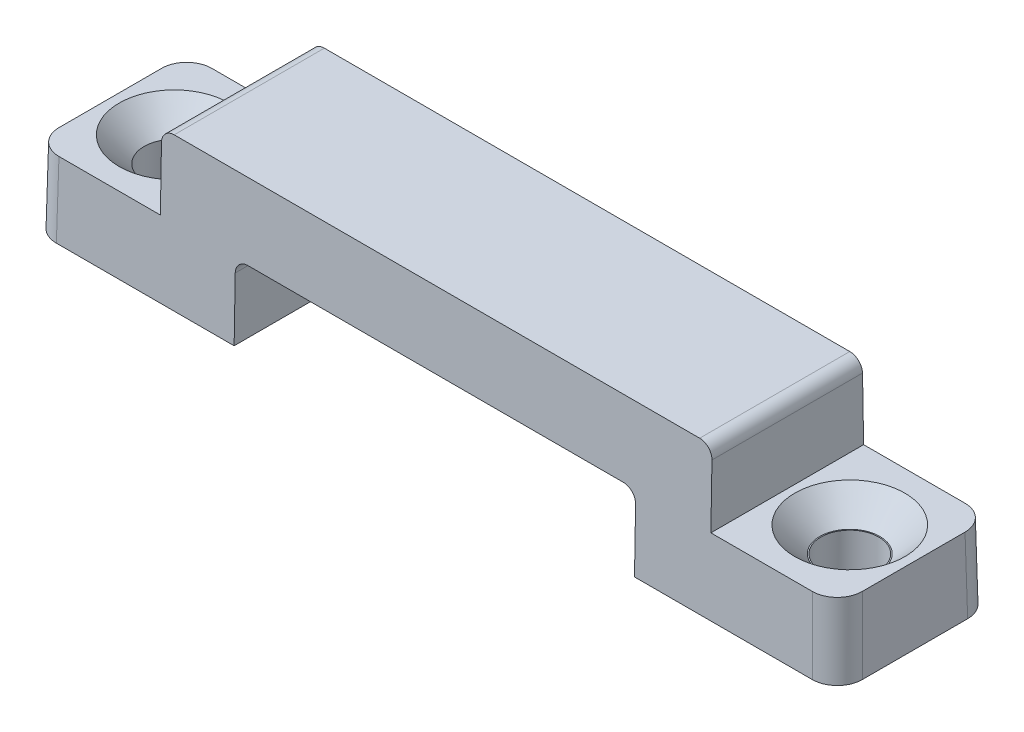
ISO-10303-21;
HEADER;
FILE_DESCRIPTION(('STEP AP214'),'2;1');
FILE_NAME('part.step','',(''),(''),'','','');
FILE_SCHEMA(('AUTOMOTIVE_DESIGN { 1 0 10303 214 1 1 1 1 }'));
ENDSEC;
DATA;
#1=APPLICATION_CONTEXT('core data for automotive mechanical design processes');
#2=APPLICATION_PROTOCOL_DEFINITION('international standard','automotive_design',2000,#1);
#3=PRODUCT_CONTEXT('',#1,'mechanical');
#4=PRODUCT('Part','Part','',(#3));
#5=PRODUCT_RELATED_PRODUCT_CATEGORY('part','',(#4));
#6=PRODUCT_DEFINITION_FORMATION('','',#4);
#7=PRODUCT_DEFINITION_CONTEXT('part definition',#1,'design');
#8=PRODUCT_DEFINITION('design','',#6,#7);
#9=PRODUCT_DEFINITION_SHAPE('','',#8);
#10=(LENGTH_UNIT() NAMED_UNIT(*) SI_UNIT(.MILLI.,.METRE.));
#11=(NAMED_UNIT(*) PLANE_ANGLE_UNIT() SI_UNIT($,.RADIAN.));
#12=(NAMED_UNIT(*) SI_UNIT($,.STERADIAN.) SOLID_ANGLE_UNIT());
#13=UNCERTAINTY_MEASURE_WITH_UNIT(LENGTH_MEASURE(1.E-05),#10,'distance_accuracy_value','');
#14=(GEOMETRIC_REPRESENTATION_CONTEXT(3) GLOBAL_UNCERTAINTY_ASSIGNED_CONTEXT((#13)) GLOBAL_UNIT_ASSIGNED_CONTEXT((#10,
#11,#12)) REPRESENTATION_CONTEXT('',''));
#15=CARTESIAN_POINT('',(0.,0.,0.));
#16=DIRECTION('',(0.,0.,1.));
#17=DIRECTION('',(1.,0.,0.));
#18=AXIS2_PLACEMENT_3D('',#15,#16,#17);
#19=CARTESIAN_POINT('',(-11.,0.,3.));
#20=DIRECTION('',(0.,1.,0.));
#21=DIRECTION('',(-1.,0.,0.));
#22=AXIS2_PLACEMENT_3D('',#19,#20,#21);
#23=PLANE('',#22);
#24=CARTESIAN_POINT('',(-13.5,0.,0.));
#25=DIRECTION('',(0.,1.,0.));
#26=DIRECTION('',(-1.,0.,0.));
#27=AXIS2_PLACEMENT_3D('',#24,#25,#26);
#28=CIRCLE('',#27,1.24339997436883);
#29=CARTESIAN_POINT('',(-14.7433999743688,0.,0.));
#30=VERTEX_POINT('',#29);
#31=EDGE_CURVE('E730',#30,#30,#28,.F.);
#32=ORIENTED_EDGE('',*,*,#31,.F.);
#33=EDGE_LOOP('',(#32));
#34=FACE_BOUND('',#33,.T.);
#35=DIRECTION('',(0.,0.,1.));
#36=VECTOR('',#35,1.);
#37=CARTESIAN_POINT('',(-16.1047303895693,0.,3.));
#38=LINE('',#37,#36);
#39=CARTESIAN_POINT('',(-16.1047303895693,0.,2.10488269441291));
#40=VERTEX_POINT('',#39);
#41=CARTESIAN_POINT('',(-16.1047303895693,0.,-2.10488269441291));
#42=VERTEX_POINT('',#41);
#43=EDGE_CURVE('E254',#40,#42,#38,.F.);
#44=ORIENTED_EDGE('',*,*,#43,.T.);
#45=CARTESIAN_POINT('',(-15.1045780615254,0.,-2.1045780615254));
#46=DIRECTION('',(0.,1.,0.));
#47=DIRECTION('',(-0.707106781186544,0.,-0.707106781186551));
#48=AXIS2_PLACEMENT_3D('',#45,#46,#47);
#49=ELLIPSE('',#48,1.00030463289105,1.);
#50=CARTESIAN_POINT('',(-15.1048826944129,0.,-3.10473038956931));
#51=VERTEX_POINT('',#50);
#52=EDGE_CURVE('E359',#42,#51,#49,.F.);
#53=ORIENTED_EDGE('',*,*,#52,.T.);
#54=DIRECTION('',(-1.,0.,0.));
#55=VECTOR('',#54,1.);
#56=CARTESIAN_POINT('',(-11.,0.,-3.10473038956931));
#57=LINE('',#56,#55);
#58=CARTESIAN_POINT('',(-8.,0.,-3.10473038956931));
#59=VERTEX_POINT('',#58);
#60=EDGE_CURVE('E275',#51,#59,#57,.F.);
#61=ORIENTED_EDGE('',*,*,#60,.T.);
#62=DIRECTION('',(0.,0.,-1.));
#63=VECTOR('',#62,1.);
#64=CARTESIAN_POINT('',(-8.,0.,3.));
#65=LINE('',#64,#63);
#66=CARTESIAN_POINT('',(-8.,0.,3.10473038956931));
#67=VERTEX_POINT('',#66);
#68=EDGE_CURVE('E391',#67,#59,#65,.T.);
#69=ORIENTED_EDGE('',*,*,#68,.F.);
#70=DIRECTION('',(1.,0.,0.));
#71=VECTOR('',#70,1.);
#72=CARTESIAN_POINT('',(-11.,0.,3.10473038956931));
#73=LINE('',#72,#71);
#74=CARTESIAN_POINT('',(-15.1048826944129,0.,3.10473038956931));
#75=VERTEX_POINT('',#74);
#76=EDGE_CURVE('E248',#75,#67,#73,.T.);
#77=ORIENTED_EDGE('',*,*,#76,.F.);
#78=CARTESIAN_POINT('',(-15.1045780615254,0.,2.1045780615254));
#79=DIRECTION('',(0.,1.,0.));
#80=DIRECTION('',(-0.707106781186544,0.,0.707106781186551));
#81=AXIS2_PLACEMENT_3D('',#78,#79,#80);
#82=ELLIPSE('',#81,1.00030463289105,1.);
#83=EDGE_CURVE('E357',#75,#40,#82,.F.);
#84=ORIENTED_EDGE('',*,*,#83,.T.);
#85=EDGE_LOOP('',(#44,#53,#61,#69,#77,#84));
#86=FACE_BOUND('',#85,.T.);
#87=ADVANCED_FACE('F42',(#34,#86),#23,.F.);
#88=CARTESIAN_POINT('',(-8.,0.,3.));
#89=DIRECTION('',(-1.,0.,0.));
#90=DIRECTION('',(0.,0.,1.));
#91=AXIS2_PLACEMENT_3D('',#88,#89,#90);
#92=PLANE('',#91);
#93=DIRECTION('',(0.,-0.999847695156391,-0.0174524064372835));
#94=VECTOR('',#93,1.);
#95=CARTESIAN_POINT('',(-8.,0.106526009050215,-3.10287097116479));
#96=LINE('',#95,#94);
#97=CARTESIAN_POINT('',(-8.,2.5,-3.06109272724876));
#98=VERTEX_POINT('',#97);
#99=EDGE_CURVE('E273',#59,#98,#96,.F.);
#100=ORIENTED_EDGE('',*,*,#99,.T.);
#101=DIRECTION('',(0.,0.,-1.));
#102=VECTOR('',#101,1.);
#103=CARTESIAN_POINT('',(-8.,2.5,3.));
#104=LINE('',#103,#102);
#105=CARTESIAN_POINT('',(-8.,2.5,3.06109272724876));
#106=VERTEX_POINT('',#105);
#107=EDGE_CURVE('E388',#98,#106,#104,.F.);
#108=ORIENTED_EDGE('',*,*,#107,.T.);
#109=DIRECTION('',(0.,0.999847695156391,-0.0174524064372835));
#110=VECTOR('',#109,1.);
#111=CARTESIAN_POINT('',(-8.,0.00182751894271233,3.1046984901075));
#112=LINE('',#111,#110);
#113=EDGE_CURVE('E270',#67,#106,#112,.T.);
#114=ORIENTED_EDGE('',*,*,#113,.F.);
#115=ORIENTED_EDGE('',*,*,#68,.T.);
#116=EDGE_LOOP('',(#100,#108,#114,#115));
#117=FACE_BOUND('',#116,.T.);
#118=ADVANCED_FACE('F389',(#117),#92,.F.);
#119=CARTESIAN_POINT('',(-8.,3.,3.));
#120=DIRECTION('',(0.,1.,0.));
#121=DIRECTION('',(-1.,0.,0.));
#122=AXIS2_PLACEMENT_3D('',#119,#120,#121);
#123=PLANE('',#122);
#124=DIRECTION('',(1.,0.,0.));
#125=VECTOR('',#124,1.);
#126=CARTESIAN_POINT('',(-8.,3.,3.05236519478465));
#127=LINE('',#126,#125);
#128=CARTESIAN_POINT('',(-7.5,3.,3.05236519478465));
#129=VERTEX_POINT('',#128);
#130=CARTESIAN_POINT('',(7.5,3.,3.05236519478465));
#131=VERTEX_POINT('',#130);
#132=EDGE_CURVE('E308',#129,#131,#127,.T.);
#133=ORIENTED_EDGE('',*,*,#132,.F.);
#134=DIRECTION('',(0.,0.,-1.));
#135=VECTOR('',#134,1.);
#136=CARTESIAN_POINT('',(-7.5,3.,-3.));
#137=LINE('',#136,#135);
#138=CARTESIAN_POINT('',(-7.5,3.,-3.05236519478465));
#139=VERTEX_POINT('',#138);
#140=EDGE_CURVE('E400',#129,#139,#137,.T.);
#141=ORIENTED_EDGE('',*,*,#140,.T.);
#142=DIRECTION('',(-1.,0.,0.));
#143=VECTOR('',#142,1.);
#144=CARTESIAN_POINT('',(-8.,3.,-3.05236519478465));
#145=LINE('',#144,#143);
#146=CARTESIAN_POINT('',(7.5,3.,-3.05236519478465));
#147=VERTEX_POINT('',#146);
#148=EDGE_CURVE('E278',#139,#147,#145,.F.);
#149=ORIENTED_EDGE('',*,*,#148,.T.);
#150=DIRECTION('',(0.,0.,-1.));
#151=VECTOR('',#150,1.);
#152=CARTESIAN_POINT('',(7.5,3.,3.));
#153=LINE('',#152,#151);
#154=EDGE_CURVE('E404',#147,#131,#153,.F.);
#155=ORIENTED_EDGE('',*,*,#154,.T.);
#156=EDGE_LOOP('',(#133,#141,#149,#155));
#157=FACE_BOUND('',#156,.T.);
#158=ADVANCED_FACE('F434',(#157),#123,.F.);
#159=CARTESIAN_POINT('',(8.,3.,3.));
#160=DIRECTION('',(1.,0.,0.));
#161=DIRECTION('',(0.,0.,-1.));
#162=AXIS2_PLACEMENT_3D('',#159,#160,#161);
#163=PLANE('',#162);
#164=DIRECTION('',(0.,-0.999847695156391,0.0174524064372835));
#165=VECTOR('',#164,1.);
#166=CARTESIAN_POINT('',(8.,3.00091375947136,3.05234924505375));
#167=LINE('',#166,#165);
#168=CARTESIAN_POINT('',(8.,2.5,3.06109272724876));
#169=VERTEX_POINT('',#168);
#170=CARTESIAN_POINT('',(8.,0.,3.10473038956931));
#171=VERTEX_POINT('',#170);
#172=EDGE_CURVE('E304',#169,#171,#167,.T.);
#173=ORIENTED_EDGE('',*,*,#172,.F.);
#174=DIRECTION('',(0.,0.,-1.));
#175=VECTOR('',#174,1.);
#176=CARTESIAN_POINT('',(8.,2.5,-3.));
#177=LINE('',#176,#175);
#178=CARTESIAN_POINT('',(8.,2.5,-3.06109272724876));
#179=VERTEX_POINT('',#178);
#180=EDGE_CURVE('E284',#169,#179,#177,.T.);
#181=ORIENTED_EDGE('',*,*,#180,.T.);
#182=DIRECTION('',(0.,0.999847695156391,0.0174524064372835));
#183=VECTOR('',#182,1.);
#184=CARTESIAN_POINT('',(8.,3.10561224957886,-3.05052172611104));
#185=LINE('',#184,#183);
#186=CARTESIAN_POINT('',(8.,0.,-3.10473038956931));
#187=VERTEX_POINT('',#186);
#188=EDGE_CURVE('E286',#179,#187,#185,.F.);
#189=ORIENTED_EDGE('',*,*,#188,.T.);
#190=DIRECTION('',(0.,0.,-1.));
#191=VECTOR('',#190,1.);
#192=CARTESIAN_POINT('',(8.,0.,3.));
#193=LINE('',#192,#191);
#194=EDGE_CURVE('E305',#171,#187,#193,.T.);
#195=ORIENTED_EDGE('',*,*,#194,.F.);
#196=EDGE_LOOP('',(#173,#181,#189,#195));
#197=FACE_BOUND('',#196,.T.);
#198=ADVANCED_FACE('F442',(#197),#163,.F.);
#199=CARTESIAN_POINT('',(16.,0.,3.));
#200=DIRECTION('',(0.,1.,0.));
#201=DIRECTION('',(-1.,0.,0.));
#202=AXIS2_PLACEMENT_3D('',#199,#200,#201);
#203=PLANE('',#202);
#204=CARTESIAN_POINT('',(13.5,0.,0.));
#205=DIRECTION('',(0.,1.,0.));
#206=DIRECTION('',(-1.,0.,0.));
#207=AXIS2_PLACEMENT_3D('',#204,#205,#206);
#208=CIRCLE('',#207,1.15667148221935);
#209=CARTESIAN_POINT('',(12.3433285177807,0.,0.));
#210=VERTEX_POINT('',#209);
#211=EDGE_CURVE('E720',#210,#210,#208,.F.);
#212=ORIENTED_EDGE('',*,*,#211,.F.);
#213=EDGE_LOOP('',(#212));
#214=FACE_BOUND('',#213,.T.);
#215=DIRECTION('',(-1.,0.,0.));
#216=VECTOR('',#215,1.);
#217=CARTESIAN_POINT('',(16.,0.,-3.10473038956931));
#218=LINE('',#217,#216);
#219=CARTESIAN_POINT('',(15.1048826944129,0.,-3.10473038956931));
#220=VERTEX_POINT('',#219);
#221=EDGE_CURVE('E230',#187,#220,#218,.F.);
#222=ORIENTED_EDGE('',*,*,#221,.T.);
#223=CARTESIAN_POINT('',(15.1045780615254,0.,-2.1045780615254));
#224=DIRECTION('',(0.,1.,0.));
#225=DIRECTION('',(-0.707106781186545,0.,0.70710678118655));
#226=AXIS2_PLACEMENT_3D('',#223,#224,#225);
#227=ELLIPSE('',#226,1.00030463289105,1.);
#228=CARTESIAN_POINT('',(16.1047303895693,0.,-2.10488269441291));
#229=VERTEX_POINT('',#228);
#230=EDGE_CURVE('E345',#220,#229,#227,.F.);
#231=ORIENTED_EDGE('',*,*,#230,.T.);
#232=DIRECTION('',(0.,0.,1.));
#233=VECTOR('',#232,1.);
#234=CARTESIAN_POINT('',(16.1047303895693,0.,3.));
#235=LINE('',#234,#233);
#236=CARTESIAN_POINT('',(16.1047303895693,0.,2.10488269441291));
#237=VERTEX_POINT('',#236);
#238=EDGE_CURVE('E223',#237,#229,#235,.F.);
#239=ORIENTED_EDGE('',*,*,#238,.F.);
#240=CARTESIAN_POINT('',(15.1045780615254,0.,2.1045780615254));
#241=DIRECTION('',(0.,1.,0.));
#242=DIRECTION('',(-0.707106781186545,0.,-0.70710678118655));
#243=AXIS2_PLACEMENT_3D('',#240,#241,#242);
#244=ELLIPSE('',#243,1.00030463289105,1.);
#245=CARTESIAN_POINT('',(15.1048826944129,0.,3.10473038956931));
#246=VERTEX_POINT('',#245);
#247=EDGE_CURVE('E339',#237,#246,#244,.F.);
#248=ORIENTED_EDGE('',*,*,#247,.T.);
#249=DIRECTION('',(1.,0.,0.));
#250=VECTOR('',#249,1.);
#251=CARTESIAN_POINT('',(16.,0.,3.10473038956931));
#252=LINE('',#251,#250);
#253=EDGE_CURVE('E191',#171,#246,#252,.T.);
#254=ORIENTED_EDGE('',*,*,#253,.F.);
#255=ORIENTED_EDGE('',*,*,#194,.T.);
#256=EDGE_LOOP('',(#222,#231,#239,#248,#254,#255));
#257=FACE_BOUND('',#256,.T.);
#258=ADVANCED_FACE('F448',(#214,#257),#203,.F.);
#259=CARTESIAN_POINT('',(16.,6.,3.));
#260=DIRECTION('',(0.999847695156391,0.0174524064372835,0.));
#261=DIRECTION('',(-0.0174524064372835,0.999847695156391,0.));
#262=AXIS2_PLACEMENT_3D('',#259,#260,#261);
#263=PLANE('',#262);
#264=ORIENTED_EDGE('',*,*,#238,.T.);
#265=DIRECTION('',(0.0174497491606827,-0.999695459881888,-0.0174497491606827));
#266=VECTOR('',#265,1.);
#267=CARTESIAN_POINT('',(15.9984774848953,6.08722483193201,-1.99862978973888));
#268=LINE('',#267,#266);
#269=CARTESIAN_POINT('',(16.0523651947847,3.,-2.05251749962826));
#270=VERTEX_POINT('',#269);
#271=EDGE_CURVE('E324',#229,#270,#268,.F.);
#272=ORIENTED_EDGE('',*,*,#271,.T.);
#273=DIRECTION('',(0.,0.,1.));
#274=VECTOR('',#273,1.);
#275=CARTESIAN_POINT('',(16.0523651947847,3.,3.));
#276=LINE('',#275,#274);
#277=CARTESIAN_POINT('',(16.0523651947847,3.,2.05251749962826));
#278=VERTEX_POINT('',#277);
#279=EDGE_CURVE('E207',#278,#270,#276,.F.);
#280=ORIENTED_EDGE('',*,*,#279,.F.);
#281=DIRECTION('',(-0.0174497491606827,0.999695459881888,-0.0174497491606827));
#282=VECTOR('',#281,1.);
#283=CARTESIAN_POINT('',(16.1050348369392,-0.0174417781400661,2.10518714178281));
#284=LINE('',#283,#282);
#285=EDGE_CURVE('E318',#278,#237,#284,.F.);
#286=ORIENTED_EDGE('',*,*,#285,.T.);
#287=EDGE_LOOP('',(#264,#272,#280,#286));
#288=FACE_BOUND('',#287,.T.);
#289=ADVANCED_FACE('F458',(#288),#263,.T.);
#290=CARTESIAN_POINT('',(11.,3.,3.));
#291=DIRECTION('',(0.,-1.,0.));
#292=DIRECTION('',(0.,0.,-1.));
#293=AXIS2_PLACEMENT_3D('',#290,#291,#292);
#294=PLANE('',#293);
#295=CARTESIAN_POINT('',(13.5,3.,0.));
#296=DIRECTION('',(0.,1.,0.));
#297=DIRECTION('',(0.,0.,1.));
#298=AXIS2_PLACEMENT_3D('',#295,#296,#297);
#299=CIRCLE('',#298,2.2);
#300=CARTESIAN_POINT('',(13.5,3.,2.2));
#301=VERTEX_POINT('',#300);
#302=EDGE_CURVE('E277',#301,#301,#299,.T.);
#303=ORIENTED_EDGE('',*,*,#302,.F.);
#304=EDGE_LOOP('',(#303));
#305=FACE_BOUND('',#304,.T.);
#306=ORIENTED_EDGE('',*,*,#279,.T.);
#307=CARTESIAN_POINT('',(15.0522128667407,3.,-2.05221286674075));
#308=DIRECTION('',(0.,-1.,0.));
#309=DIRECTION('',(-0.707106781186548,0.,0.707106781186548));
#310=AXIS2_PLACEMENT_3D('',#307,#308,#309);
#311=ELLIPSE('',#310,1.00030463289105,1.);
#312=CARTESIAN_POINT('',(15.0525174996283,3.,-3.05236519478465));
#313=VERTEX_POINT('',#312);
#314=EDGE_CURVE('E329',#270,#313,#311,.F.);
#315=ORIENTED_EDGE('',*,*,#314,.T.);
#316=DIRECTION('',(1.,0.,0.));
#317=VECTOR('',#316,1.);
#318=CARTESIAN_POINT('',(11.,3.,-3.05236519478465));
#319=LINE('',#318,#317);
#320=CARTESIAN_POINT('',(11.,3.,-3.05236519478465));
#321=VERTEX_POINT('',#320);
#322=EDGE_CURVE('E202',#313,#321,#319,.F.);
#323=ORIENTED_EDGE('',*,*,#322,.T.);
#324=DIRECTION('',(0.,0.,-1.));
#325=VECTOR('',#324,1.);
#326=CARTESIAN_POINT('',(11.,3.,3.));
#327=LINE('',#326,#325);
#328=CARTESIAN_POINT('',(11.,3.,3.05236519478465));
#329=VERTEX_POINT('',#328);
#330=EDGE_CURVE('E200',#329,#321,#327,.T.);
#331=ORIENTED_EDGE('',*,*,#330,.F.);
#332=DIRECTION('',(-1.,0.,0.));
#333=VECTOR('',#332,1.);
#334=CARTESIAN_POINT('',(11.,3.,3.05236519478465));
#335=LINE('',#334,#333);
#336=CARTESIAN_POINT('',(15.0525174996283,3.,3.05236519478465));
#337=VERTEX_POINT('',#336);
#338=EDGE_CURVE('E182',#337,#329,#335,.T.);
#339=ORIENTED_EDGE('',*,*,#338,.F.);
#340=CARTESIAN_POINT('',(15.0522128667407,3.,2.05221286674074));
#341=DIRECTION('',(0.,-1.,0.));
#342=DIRECTION('',(-0.707106781186548,0.,-0.707106781186548));
#343=AXIS2_PLACEMENT_3D('',#340,#341,#342);
#344=ELLIPSE('',#343,1.00030463289105,1.);
#345=EDGE_CURVE('E330',#337,#278,#344,.F.);
#346=ORIENTED_EDGE('',*,*,#345,.T.);
#347=EDGE_LOOP('',(#306,#315,#323,#331,#339,#346));
#348=FACE_BOUND('',#347,.T.);
#349=ADVANCED_FACE('F197',(#305,#348),#294,.F.);
#350=CARTESIAN_POINT('',(11.,3.,3.));
#351=DIRECTION('',(-1.,0.,0.));
#352=DIRECTION('',(0.,0.,1.));
#353=AXIS2_PLACEMENT_3D('',#350,#351,#352);
#354=PLANE('',#353);
#355=DIRECTION('',(0.,-0.999847695156391,-0.0174524064372835));
#356=VECTOR('',#355,1.);
#357=CARTESIAN_POINT('',(11.,3.10561224957886,-3.05052172611104));
#358=LINE('',#357,#356);
#359=CARTESIAN_POINT('',(11.,5.5,-3.00872753246411));
#360=VERTEX_POINT('',#359);
#361=EDGE_CURVE('E226',#321,#360,#358,.F.);
#362=ORIENTED_EDGE('',*,*,#361,.T.);
#363=DIRECTION('',(0.,0.,-1.));
#364=VECTOR('',#363,1.);
#365=CARTESIAN_POINT('',(11.,5.5,3.));
#366=LINE('',#365,#364);
#367=CARTESIAN_POINT('',(11.,5.5,3.00872753246411));
#368=VERTEX_POINT('',#367);
#369=EDGE_CURVE('E212',#360,#368,#366,.F.);
#370=ORIENTED_EDGE('',*,*,#369,.T.);
#371=DIRECTION('',(0.,0.999847695156391,-0.0174524064372835));
#372=VECTOR('',#371,1.);
#373=CARTESIAN_POINT('',(11.,3.00091375947136,3.05234924505375));
#374=LINE('',#373,#372);
#375=EDGE_CURVE('E189',#329,#368,#374,.T.);
#376=ORIENTED_EDGE('',*,*,#375,.F.);
#377=ORIENTED_EDGE('',*,*,#330,.T.);
#378=EDGE_LOOP('',(#362,#370,#376,#377));
#379=FACE_BOUND('',#378,.T.);
#380=ADVANCED_FACE('F209',(#379),#354,.F.);
#381=CARTESIAN_POINT('',(11.,6.,3.));
#382=DIRECTION('',(0.,-1.,0.));
#383=DIRECTION('',(0.,0.,-1.));
#384=AXIS2_PLACEMENT_3D('',#381,#382,#383);
#385=PLANE('',#384);
#386=DIRECTION('',(-1.,0.,0.));
#387=VECTOR('',#386,1.);
#388=CARTESIAN_POINT('',(11.,6.,3.));
#389=LINE('',#388,#387);
#390=CARTESIAN_POINT('',(10.5,6.,3.));
#391=VERTEX_POINT('',#390);
#392=CARTESIAN_POINT('',(-10.5,6.,3.));
#393=VERTEX_POINT('',#392);
#394=EDGE_CURVE('E214',#391,#393,#389,.T.);
#395=ORIENTED_EDGE('',*,*,#394,.F.);
#396=DIRECTION('',(0.,0.,-1.));
#397=VECTOR('',#396,1.);
#398=CARTESIAN_POINT('',(10.5,6.,3.));
#399=LINE('',#398,#397);
#400=CARTESIAN_POINT('',(10.5,6.,-3.));
#401=VERTEX_POINT('',#400);
#402=EDGE_CURVE('E243',#391,#401,#399,.T.);
#403=ORIENTED_EDGE('',*,*,#402,.T.);
#404=DIRECTION('',(1.,0.,0.));
#405=VECTOR('',#404,1.);
#406=CARTESIAN_POINT('',(11.,6.,-3.));
#407=LINE('',#406,#405);
#408=CARTESIAN_POINT('',(-10.5,6.,-3.));
#409=VERTEX_POINT('',#408);
#410=EDGE_CURVE('E235',#401,#409,#407,.F.);
#411=ORIENTED_EDGE('',*,*,#410,.T.);
#412=DIRECTION('',(0.,0.,-1.));
#413=VECTOR('',#412,1.);
#414=CARTESIAN_POINT('',(-10.5,6.,3.));
#415=LINE('',#414,#413);
#416=EDGE_CURVE('E311',#409,#393,#415,.F.);
#417=ORIENTED_EDGE('',*,*,#416,.T.);
#418=EDGE_LOOP('',(#395,#403,#411,#417));
#419=FACE_BOUND('',#418,.T.);
#420=ADVANCED_FACE('F470',(#419),#385,.F.);
#421=CARTESIAN_POINT('',(-11.,6.,3.));
#422=DIRECTION('',(1.,0.,0.));
#423=DIRECTION('',(0.,0.,-1.));
#424=AXIS2_PLACEMENT_3D('',#421,#422,#423);
#425=PLANE('',#424);
#426=DIRECTION('',(0.,-0.999847695156391,0.0174524064372835));
#427=VECTOR('',#426,1.);
#428=CARTESIAN_POINT('',(-11.,6.,3.));
#429=LINE('',#428,#427);
#430=CARTESIAN_POINT('',(-11.,5.5,3.00872753246411));
#431=VERTEX_POINT('',#430);
#432=CARTESIAN_POINT('',(-11.,3.,3.05236519478465));
#433=VERTEX_POINT('',#432);
#434=EDGE_CURVE('E220',#431,#433,#429,.T.);
#435=ORIENTED_EDGE('',*,*,#434,.F.);
#436=DIRECTION('',(0.,0.,-1.));
#437=VECTOR('',#436,1.);
#438=CARTESIAN_POINT('',(-11.,5.5,3.));
#439=LINE('',#438,#437);
#440=CARTESIAN_POINT('',(-11.,5.5,-3.00872753246411));
#441=VERTEX_POINT('',#440);
#442=EDGE_CURVE('E219',#431,#441,#439,.T.);
#443=ORIENTED_EDGE('',*,*,#442,.T.);
#444=DIRECTION('',(0.,0.999847695156391,0.0174524064372835));
#445=VECTOR('',#444,1.);
#446=CARTESIAN_POINT('',(-11.,6.1046984901075,-2.99817248105729));
#447=LINE('',#446,#445);
#448=CARTESIAN_POINT('',(-11.,3.,-3.05236519478465));
#449=VERTEX_POINT('',#448);
#450=EDGE_CURVE('E239',#441,#449,#447,.F.);
#451=ORIENTED_EDGE('',*,*,#450,.T.);
#452=DIRECTION('',(0.,0.,-1.));
#453=VECTOR('',#452,1.);
#454=CARTESIAN_POINT('',(-11.,3.,3.));
#455=LINE('',#454,#453);
#456=EDGE_CURVE('E210',#433,#449,#455,.T.);
#457=ORIENTED_EDGE('',*,*,#456,.F.);
#458=EDGE_LOOP('',(#435,#443,#451,#457));
#459=FACE_BOUND('',#458,.T.);
#460=ADVANCED_FACE('F420',(#459),#425,.F.);
#461=CARTESIAN_POINT('',(-11.,3.,3.));
#462=DIRECTION('',(0.,-1.,0.));
#463=DIRECTION('',(1.,0.,0.));
#464=AXIS2_PLACEMENT_3D('',#461,#462,#463);
#465=PLANE('',#464);
#466=CARTESIAN_POINT('',(-13.5,3.,0.));
#467=DIRECTION('',(0.,1.,0.));
#468=DIRECTION('',(0.,0.,1.));
#469=AXIS2_PLACEMENT_3D('',#466,#467,#468);
#470=CIRCLE('',#469,2.2);
#471=CARTESIAN_POINT('',(-13.5,3.,2.2));
#472=VERTEX_POINT('',#471);
#473=EDGE_CURVE('E731',#472,#472,#470,.T.);
#474=ORIENTED_EDGE('',*,*,#473,.F.);
#475=EDGE_LOOP('',(#474));
#476=FACE_BOUND('',#475,.T.);
#477=DIRECTION('',(1.,0.,0.));
#478=VECTOR('',#477,1.);
#479=CARTESIAN_POINT('',(-11.,3.,-3.05236519478465));
#480=LINE('',#479,#478);
#481=CARTESIAN_POINT('',(-15.0525174996283,3.,-3.05236519478465));
#482=VERTEX_POINT('',#481);
#483=EDGE_CURVE('E246',#449,#482,#480,.F.);
#484=ORIENTED_EDGE('',*,*,#483,.T.);
#485=CARTESIAN_POINT('',(-15.0522128667407,3.,-2.05221286674075));
#486=DIRECTION('',(0.,-1.,0.));
#487=DIRECTION('',(-0.707106781186549,0.,-0.707106781186546));
#488=AXIS2_PLACEMENT_3D('',#485,#486,#487);
#489=ELLIPSE('',#488,1.00030463289105,1.);
#490=CARTESIAN_POINT('',(-16.0523651947847,3.,-2.05251749962826));
#491=VERTEX_POINT('',#490);
#492=EDGE_CURVE('E11',#482,#491,#489,.F.);
#493=ORIENTED_EDGE('',*,*,#492,.T.);
#494=DIRECTION('',(0.,0.,1.));
#495=VECTOR('',#494,1.);
#496=CARTESIAN_POINT('',(-16.0523651947847,3.,3.));
#497=LINE('',#496,#495);
#498=CARTESIAN_POINT('',(-16.0523651947847,3.,2.05251749962826));
#499=VERTEX_POINT('',#498);
#500=EDGE_CURVE('E249',#499,#491,#497,.F.);
#501=ORIENTED_EDGE('',*,*,#500,.F.);
#502=CARTESIAN_POINT('',(-15.0522128667407,3.,2.05221286674074));
#503=DIRECTION('',(0.,-1.,0.));
#504=DIRECTION('',(-0.707106781186549,0.,0.707106781186546));
#505=AXIS2_PLACEMENT_3D('',#502,#503,#504);
#506=ELLIPSE('',#505,1.00030463289105,1.);
#507=CARTESIAN_POINT('',(-15.0525174996283,3.,3.05236519478465));
#508=VERTEX_POINT('',#507);
#509=EDGE_CURVE('E52',#499,#508,#506,.F.);
#510=ORIENTED_EDGE('',*,*,#509,.T.);
#511=DIRECTION('',(-1.,0.,0.));
#512=VECTOR('',#511,1.);
#513=CARTESIAN_POINT('',(-11.,3.,3.05236519478465));
#514=LINE('',#513,#512);
#515=EDGE_CURVE('E251',#433,#508,#514,.T.);
#516=ORIENTED_EDGE('',*,*,#515,.F.);
#517=ORIENTED_EDGE('',*,*,#456,.T.);
#518=EDGE_LOOP('',(#484,#493,#501,#510,#516,#517));
#519=FACE_BOUND('',#518,.T.);
#520=ADVANCED_FACE('F362',(#476,#519),#465,.F.);
#521=CARTESIAN_POINT('',(-16.,6.,3.));
#522=DIRECTION('',(-0.999847695156391,0.0174524064372835,0.));
#523=DIRECTION('',(0.0174524064372835,0.999847695156391,0.));
#524=AXIS2_PLACEMENT_3D('',#521,#522,#523);
#525=PLANE('',#524);
#526=ORIENTED_EDGE('',*,*,#500,.T.);
#527=DIRECTION('',(0.0174497491606827,0.999695459881888,0.0174497491606827));
#528=VECTOR('',#527,1.);
#529=CARTESIAN_POINT('',(-15.9984774848953,6.08722483193201,-1.99862978973888));
#530=LINE('',#529,#528);
#531=EDGE_CURVE('E355',#491,#42,#530,.F.);
#532=ORIENTED_EDGE('',*,*,#531,.T.);
#533=ORIENTED_EDGE('',*,*,#43,.F.);
#534=DIRECTION('',(-0.0174497491606827,-0.999695459881888,0.0174497491606827));
#535=VECTOR('',#534,1.);
#536=CARTESIAN_POINT('',(-16.0526696421546,2.98255822185993,2.05282194699816));
#537=LINE('',#536,#535);
#538=EDGE_CURVE('E63',#40,#499,#537,.F.);
#539=ORIENTED_EDGE('',*,*,#538,.T.);
#540=EDGE_LOOP('',(#526,#532,#533,#539));
#541=FACE_BOUND('',#540,.T.);
#542=ADVANCED_FACE('F372',(#541),#525,.T.);
#543=CARTESIAN_POINT('',(11.,6.,3.));
#544=DIRECTION('',(0.,0.0174524064372835,0.999847695156391));
#545=DIRECTION('',(0.,0.999847695156391,-0.0174524064372835));
#546=AXIS2_PLACEMENT_3D('',#543,#544,#545);
#547=PLANE('',#546);
#548=ORIENTED_EDGE('',*,*,#253,.T.);
#549=DIRECTION('',(0.0174497491606827,-0.999695459881888,0.0174497491606827));
#550=VECTOR('',#549,1.);
#551=CARTESIAN_POINT('',(15.0528219469982,2.98255822185993,3.05266964215455));
#552=LINE('',#551,#550);
#553=EDGE_CURVE('E192',#246,#337,#552,.F.);
#554=ORIENTED_EDGE('',*,*,#553,.T.);
#555=ORIENTED_EDGE('',*,*,#338,.T.);
#556=ORIENTED_EDGE('',*,*,#375,.T.);
#557=CARTESIAN_POINT('',(10.5,5.5,3.00872753246411));
#558=DIRECTION('',(0.,0.0174524064372835,0.999847695156391));
#559=DIRECTION('',(0.,0.999847695156391,-0.0174524064372835));
#560=AXIS2_PLACEMENT_3D('',#557,#558,#559);
#561=ELLIPSE('',#560,0.500076164021954,0.5);
#562=EDGE_CURVE('E265',#368,#391,#561,.T.);
#563=ORIENTED_EDGE('',*,*,#562,.T.);
#564=ORIENTED_EDGE('',*,*,#394,.T.);
#565=CARTESIAN_POINT('',(-10.5,5.5,3.00872753246411));
#566=DIRECTION('',(0.,0.0174524064372835,0.999847695156391));
#567=DIRECTION('',(0.,0.999847695156391,-0.0174524064372835));
#568=AXIS2_PLACEMENT_3D('',#565,#566,#567);
#569=ELLIPSE('',#568,0.500076164021954,0.5);
#570=EDGE_CURVE('E258',#393,#431,#569,.T.);
#571=ORIENTED_EDGE('',*,*,#570,.T.);
#572=ORIENTED_EDGE('',*,*,#434,.T.);
#573=ORIENTED_EDGE('',*,*,#515,.T.);
#574=DIRECTION('',(0.0174497491606827,0.999695459881888,-0.0174497491606827));
#575=VECTOR('',#574,1.);
#576=CARTESIAN_POINT('',(-15.1051871417828,-0.0174417781400652,3.1050348369392));
#577=LINE('',#576,#575);
#578=EDGE_CURVE('E343',#508,#75,#577,.F.);
#579=ORIENTED_EDGE('',*,*,#578,.T.);
#580=ORIENTED_EDGE('',*,*,#76,.T.);
#581=ORIENTED_EDGE('',*,*,#113,.T.);
#582=CARTESIAN_POINT('',(-7.5,2.5,3.06109272724876));
#583=DIRECTION('',(0.,0.0174524064372835,0.999847695156391));
#584=DIRECTION('',(0.,-0.999847695156391,0.0174524064372835));
#585=AXIS2_PLACEMENT_3D('',#582,#583,#584);
#586=ELLIPSE('',#585,0.500076164021954,0.5);
#587=EDGE_CURVE('E282',#106,#129,#586,.F.);
#588=ORIENTED_EDGE('',*,*,#587,.T.);
#589=ORIENTED_EDGE('',*,*,#132,.T.);
#590=CARTESIAN_POINT('',(7.5,2.5,3.06109272724876));
#591=DIRECTION('',(0.,0.0174524064372835,0.999847695156391));
#592=DIRECTION('',(0.,-0.999847695156391,0.0174524064372835));
#593=AXIS2_PLACEMENT_3D('',#590,#591,#592);
#594=ELLIPSE('',#593,0.500076164021954,0.5);
#595=EDGE_CURVE('E291',#131,#169,#594,.F.);
#596=ORIENTED_EDGE('',*,*,#595,.T.);
#597=ORIENTED_EDGE('',*,*,#172,.T.);
#598=EDGE_LOOP('',(#548,#554,#555,#556,#563,#564,#571,#572,#573,#579,#580,#581,#588,#589,#596,#597));
#599=FACE_BOUND('',#598,.T.);
#600=ADVANCED_FACE('F187',(#599),#547,.T.);
#601=CARTESIAN_POINT('',(11.,6.,-3.));
#602=DIRECTION('',(0.,0.0174524064372835,-0.999847695156391));
#603=DIRECTION('',(0.,0.999847695156391,0.0174524064372835));
#604=AXIS2_PLACEMENT_3D('',#601,#602,#603);
#605=PLANE('',#604);
#606=ORIENTED_EDGE('',*,*,#322,.F.);
#607=DIRECTION('',(0.0174497491606827,-0.999695459881888,-0.0174497491606827));
#608=VECTOR('',#607,1.);
#609=CARTESIAN_POINT('',(14.9989342834847,6.06978039691999,-2.99878197864104));
#610=LINE('',#609,#608);
#611=EDGE_CURVE('E337',#313,#220,#610,.T.);
#612=ORIENTED_EDGE('',*,*,#611,.T.);
#613=ORIENTED_EDGE('',*,*,#221,.F.);
#614=ORIENTED_EDGE('',*,*,#188,.F.);
#615=CARTESIAN_POINT('',(7.5,2.5,-3.06109272724876));
#616=DIRECTION('',(0.,0.0174524064372835,-0.999847695156391));
#617=DIRECTION('',(0.,0.999847695156391,0.0174524064372835));
#618=AXIS2_PLACEMENT_3D('',#615,#616,#617);
#619=ELLIPSE('',#618,0.500076164021954,0.5);
#620=EDGE_CURVE('E288',#179,#147,#619,.F.);
#621=ORIENTED_EDGE('',*,*,#620,.T.);
#622=ORIENTED_EDGE('',*,*,#148,.F.);
#623=CARTESIAN_POINT('',(-7.5,2.5,-3.06109272724876));
#624=DIRECTION('',(0.,0.0174524064372835,-0.999847695156391));
#625=DIRECTION('',(0.,0.999847695156391,0.0174524064372835));
#626=AXIS2_PLACEMENT_3D('',#623,#624,#625);
#627=ELLIPSE('',#626,0.500076164021954,0.5);
#628=EDGE_CURVE('E281',#139,#98,#627,.F.);
#629=ORIENTED_EDGE('',*,*,#628,.T.);
#630=ORIENTED_EDGE('',*,*,#99,.F.);
#631=ORIENTED_EDGE('',*,*,#60,.F.);
#632=DIRECTION('',(0.0174497491606827,0.999695459881888,0.0174497491606827));
#633=VECTOR('',#632,1.);
#634=CARTESIAN_POINT('',(-14.9922354210777,6.45355796718426,-2.99208311623409));
#635=LINE('',#634,#633);
#636=EDGE_CURVE('E335',#51,#482,#635,.T.);
#637=ORIENTED_EDGE('',*,*,#636,.T.);
#638=ORIENTED_EDGE('',*,*,#483,.F.);
#639=ORIENTED_EDGE('',*,*,#450,.F.);
#640=CARTESIAN_POINT('',(-10.5,5.5,-3.00872753246411));
#641=DIRECTION('',(0.,0.0174524064372835,-0.999847695156391));
#642=DIRECTION('',(0.,-0.999847695156391,-0.0174524064372835));
#643=AXIS2_PLACEMENT_3D('',#640,#641,#642);
#644=ELLIPSE('',#643,0.500076164021954,0.5);
#645=EDGE_CURVE('E236',#441,#409,#644,.T.);
#646=ORIENTED_EDGE('',*,*,#645,.T.);
#647=ORIENTED_EDGE('',*,*,#410,.F.);
#648=CARTESIAN_POINT('',(10.5,5.5,-3.00872753246411));
#649=DIRECTION('',(0.,0.0174524064372835,-0.999847695156391));
#650=DIRECTION('',(0.,-0.999847695156391,-0.0174524064372835));
#651=AXIS2_PLACEMENT_3D('',#648,#649,#650);
#652=ELLIPSE('',#651,0.500076164021954,0.5);
#653=EDGE_CURVE('E231',#401,#360,#652,.T.);
#654=ORIENTED_EDGE('',*,*,#653,.T.);
#655=ORIENTED_EDGE('',*,*,#361,.F.);
#656=EDGE_LOOP('',(#606,#612,#613,#614,#621,#622,#629,#630,#631,#637,#638,#639,#646,#647,#654,#655));
#657=FACE_BOUND('',#656,.T.);
#658=ADVANCED_FACE('F384',(#657),#605,.T.);
#659=CARTESIAN_POINT('',(13.5,3.,0.));
#660=DIRECTION('',(0.,1.,0.));
#661=DIRECTION('',(0.,0.,1.));
#662=AXIS2_PLACEMENT_3D('',#659,#660,#661);
#663=CONICAL_SURFACE('',#662,2.2,0.785398163397448);
#664=CARTESIAN_POINT('',(13.5,2.,0.));
#665=DIRECTION('',(0.,1.,0.));
#666=DIRECTION('',(0.,0.,1.));
#667=AXIS2_PLACEMENT_3D('',#664,#665,#666);
#668=CIRCLE('',#667,1.2);
#669=CARTESIAN_POINT('',(13.5,2.,1.2));
#670=VERTEX_POINT('',#669);
#671=EDGE_CURVE('E740',#670,#670,#668,.T.);
#672=ORIENTED_EDGE('',*,*,#671,.F.);
#673=EDGE_LOOP('',(#672));
#674=FACE_BOUND('',#673,.T.);
#675=ORIENTED_EDGE('',*,*,#302,.T.);
#676=EDGE_LOOP('',(#675));
#677=FACE_BOUND('',#676,.T.);
#678=ADVANCED_FACE('F547',(#674,#677),#663,.F.);
#679=CARTESIAN_POINT('',(14.7,2.,0.));
#680=DIRECTION('',(0.,-1.,0.));
#681=DIRECTION('',(0.,0.,-1.));
#682=AXIS2_PLACEMENT_3D('',#679,#680,#681);
#683=PLANE('',#682);
#684=CARTESIAN_POINT('',(13.5,2.,0.));
#685=DIRECTION('',(0.,1.,0.));
#686=DIRECTION('',(0.,0.,1.));
#687=AXIS2_PLACEMENT_3D('',#684,#685,#686);
#688=CIRCLE('',#687,1.15667148221935);
#689=CARTESIAN_POINT('',(13.5,2.,1.15667148221935));
#690=VERTEX_POINT('',#689);
#691=EDGE_CURVE('E719',#690,#690,#688,.T.);
#692=ORIENTED_EDGE('',*,*,#691,.F.);
#693=EDGE_LOOP('',(#692));
#694=FACE_BOUND('',#693,.T.);
#695=ORIENTED_EDGE('',*,*,#671,.T.);
#696=EDGE_LOOP('',(#695));
#697=FACE_BOUND('',#696,.T.);
#698=ADVANCED_FACE('F568',(#694,#697),#683,.F.);
#699=CARTESIAN_POINT('',(-13.5,3.,0.));
#700=DIRECTION('',(0.,1.,0.));
#701=DIRECTION('',(0.,0.,1.));
#702=AXIS2_PLACEMENT_3D('',#699,#700,#701);
#703=CONICAL_SURFACE('',#702,2.2,0.785398163397449);
#704=CARTESIAN_POINT('',(-13.5,2.,0.));
#705=DIRECTION('',(0.,1.,0.));
#706=DIRECTION('',(0.,0.,1.));
#707=AXIS2_PLACEMENT_3D('',#704,#705,#706);
#708=CIRCLE('',#707,1.2);
#709=CARTESIAN_POINT('',(-13.5,2.,1.2));
#710=VERTEX_POINT('',#709);
#711=EDGE_CURVE('E728',#710,#710,#708,.T.);
#712=ORIENTED_EDGE('',*,*,#711,.F.);
#713=EDGE_LOOP('',(#712));
#714=FACE_BOUND('',#713,.T.);
#715=ORIENTED_EDGE('',*,*,#473,.T.);
#716=EDGE_LOOP('',(#715));
#717=FACE_BOUND('',#716,.T.);
#718=ADVANCED_FACE('F576',(#714,#717),#703,.F.);
#719=CARTESIAN_POINT('',(13.5,-0.00100000000000057,0.));
#720=DIRECTION('',(0.,1.,0.));
#721=DIRECTION('',(0.,0.,1.));
#722=AXIS2_PLACEMENT_3D('',#719,#720,#721);
#723=CYLINDRICAL_SURFACE('',#722,1.15667148221935);
#724=ORIENTED_EDGE('',*,*,#691,.T.);
#725=EDGE_LOOP('',(#724));
#726=FACE_BOUND('',#725,.T.);
#727=ORIENTED_EDGE('',*,*,#211,.T.);
#728=EDGE_LOOP('',(#727));
#729=FACE_BOUND('',#728,.T.);
#730=ADVANCED_FACE('F587',(#726,#729),#723,.F.);
#731=CARTESIAN_POINT('',(-13.5,-0.00100000000000057,0.));
#732=DIRECTION('',(0.,1.,0.));
#733=DIRECTION('',(0.,0.,1.));
#734=AXIS2_PLACEMENT_3D('',#731,#732,#733);
#735=CYLINDRICAL_SURFACE('',#734,1.24339997436883);
#736=CARTESIAN_POINT('',(-13.5,2.,0.));
#737=DIRECTION('',(0.,1.,0.));
#738=DIRECTION('',(0.,0.,1.));
#739=AXIS2_PLACEMENT_3D('',#736,#737,#738);
#740=CIRCLE('',#739,1.24339997436883);
#741=CARTESIAN_POINT('',(-13.5,2.,1.24339997436883));
#742=VERTEX_POINT('',#741);
#743=EDGE_CURVE('E721',#742,#742,#740,.T.);
#744=ORIENTED_EDGE('',*,*,#743,.T.);
#745=EDGE_LOOP('',(#744));
#746=FACE_BOUND('',#745,.T.);
#747=ORIENTED_EDGE('',*,*,#31,.T.);
#748=EDGE_LOOP('',(#747));
#749=FACE_BOUND('',#748,.T.);
#750=ADVANCED_FACE('F596',(#746,#749),#735,.F.);
#751=CARTESIAN_POINT('',(-13.5,2.,0.));
#752=DIRECTION('',(0.,1.,0.));
#753=DIRECTION('',(0.,0.,1.));
#754=AXIS2_PLACEMENT_3D('',#751,#752,#753);
#755=PLANE('',#754);
#756=ORIENTED_EDGE('',*,*,#711,.T.);
#757=EDGE_LOOP('',(#756));
#758=FACE_BOUND('',#757,.T.);
#759=ORIENTED_EDGE('',*,*,#743,.F.);
#760=EDGE_LOOP('',(#759));
#761=FACE_BOUND('',#760,.T.);
#762=ADVANCED_FACE('F495',(#758,#761),#755,.F.);
#763=CARTESIAN_POINT('',(-7.5,2.5,3.));
#764=DIRECTION('',(0.,0.,1.));
#765=DIRECTION('',(1.,0.,0.));
#766=AXIS2_PLACEMENT_3D('',#763,#764,#765);
#767=CYLINDRICAL_SURFACE('',#766,0.5);
#768=ORIENTED_EDGE('',*,*,#587,.F.);
#769=ORIENTED_EDGE('',*,*,#107,.F.);
#770=ORIENTED_EDGE('',*,*,#628,.F.);
#771=ORIENTED_EDGE('',*,*,#140,.F.);
#772=EDGE_LOOP('',(#768,#769,#770,#771));
#773=FACE_BOUND('',#772,.T.);
#774=ADVANCED_FACE('F392',(#773),#767,.F.);
#775=CARTESIAN_POINT('',(7.5,2.5,3.));
#776=DIRECTION('',(0.,0.,1.));
#777=DIRECTION('',(1.,0.,0.));
#778=AXIS2_PLACEMENT_3D('',#775,#776,#777);
#779=CYLINDRICAL_SURFACE('',#778,0.5);
#780=ORIENTED_EDGE('',*,*,#595,.F.);
#781=ORIENTED_EDGE('',*,*,#154,.F.);
#782=ORIENTED_EDGE('',*,*,#620,.F.);
#783=ORIENTED_EDGE('',*,*,#180,.F.);
#784=EDGE_LOOP('',(#780,#781,#782,#783));
#785=FACE_BOUND('',#784,.T.);
#786=ADVANCED_FACE('F439',(#785),#779,.F.);
#787=CARTESIAN_POINT('',(10.5,5.5,3.));
#788=DIRECTION('',(0.,0.,-1.));
#789=DIRECTION('',(-1.,0.,0.));
#790=AXIS2_PLACEMENT_3D('',#787,#788,#789);
#791=CYLINDRICAL_SURFACE('',#790,0.5);
#792=ORIENTED_EDGE('',*,*,#562,.F.);
#793=ORIENTED_EDGE('',*,*,#369,.F.);
#794=ORIENTED_EDGE('',*,*,#653,.F.);
#795=ORIENTED_EDGE('',*,*,#402,.F.);
#796=EDGE_LOOP('',(#792,#793,#794,#795));
#797=FACE_BOUND('',#796,.T.);
#798=ADVANCED_FACE('F465',(#797),#791,.T.);
#799=CARTESIAN_POINT('',(-10.5,5.5,3.));
#800=DIRECTION('',(0.,0.,-1.));
#801=DIRECTION('',(-1.,0.,0.));
#802=AXIS2_PLACEMENT_3D('',#799,#800,#801);
#803=CYLINDRICAL_SURFACE('',#802,0.5);
#804=ORIENTED_EDGE('',*,*,#570,.F.);
#805=ORIENTED_EDGE('',*,*,#416,.F.);
#806=ORIENTED_EDGE('',*,*,#645,.F.);
#807=ORIENTED_EDGE('',*,*,#442,.F.);
#808=EDGE_LOOP('',(#804,#805,#806,#807));
#809=FACE_BOUND('',#808,.T.);
#810=ADVANCED_FACE('F469',(#809),#803,.T.);
#811=CARTESIAN_POINT('',(14.9986297897389,6.06977242549472,-1.99862978973888));
#812=DIRECTION('',(-0.0174497491606827,0.999695459881887,0.0174497491606827));
#813=DIRECTION('',(0.,-0.0174524064372835,0.999847695156391));
#814=AXIS2_PLACEMENT_3D('',#811,#812,#813);
#815=CYLINDRICAL_SURFACE('',#814,1.);
#816=ORIENTED_EDGE('',*,*,#230,.F.);
#817=ORIENTED_EDGE('',*,*,#611,.F.);
#818=ORIENTED_EDGE('',*,*,#314,.F.);
#819=ORIENTED_EDGE('',*,*,#271,.F.);
#820=EDGE_LOOP('',(#816,#817,#818,#819));
#821=FACE_BOUND('',#820,.T.);
#822=ADVANCED_FACE('F462',(#821),#815,.T.);
#823=CARTESIAN_POINT('',(14.9989342834847,6.05232799048271,1.99893428348465));
#824=DIRECTION('',(-0.0174497491606827,0.999695459881887,-0.0174497491606827));
#825=DIRECTION('',(0.,0.0174524064372835,0.999847695156391));
#826=AXIS2_PLACEMENT_3D('',#823,#824,#825);
#827=CYLINDRICAL_SURFACE('',#826,1.);
#828=ORIENTED_EDGE('',*,*,#247,.F.);
#829=ORIENTED_EDGE('',*,*,#285,.F.);
#830=ORIENTED_EDGE('',*,*,#345,.F.);
#831=ORIENTED_EDGE('',*,*,#553,.F.);
#832=EDGE_LOOP('',(#828,#829,#830,#831));
#833=FACE_BOUND('',#832,.T.);
#834=ADVANCED_FACE('F451',(#833),#827,.T.);
#835=CARTESIAN_POINT('',(-14.9986297897389,6.06977242549472,-1.99862978973888));
#836=DIRECTION('',(-0.0174497491606827,-0.999695459881887,-0.0174497491606827));
#837=DIRECTION('',(0.,0.0174524064372835,-0.999847695156391));
#838=AXIS2_PLACEMENT_3D('',#835,#836,#837);
#839=CYLINDRICAL_SURFACE('',#838,1.);
#840=ORIENTED_EDGE('',*,*,#492,.F.);
#841=ORIENTED_EDGE('',*,*,#636,.F.);
#842=ORIENTED_EDGE('',*,*,#52,.F.);
#843=ORIENTED_EDGE('',*,*,#531,.F.);
#844=EDGE_LOOP('',(#840,#841,#842,#843));
#845=FACE_BOUND('',#844,.T.);
#846=ADVANCED_FACE('F380',(#845),#839,.T.);
#847=CARTESIAN_POINT('',(-14.9922354210777,6.43610556074698,1.9922354210777));
#848=DIRECTION('',(-0.0174497491606827,-0.999695459881887,0.0174497491606827));
#849=DIRECTION('',(0.,-0.0174524064372835,-0.999847695156391));
#850=AXIS2_PLACEMENT_3D('',#847,#848,#849);
#851=CYLINDRICAL_SURFACE('',#850,1.);
#852=ORIENTED_EDGE('',*,*,#509,.F.);
#853=ORIENTED_EDGE('',*,*,#538,.F.);
#854=ORIENTED_EDGE('',*,*,#83,.F.);
#855=ORIENTED_EDGE('',*,*,#578,.F.);
#856=EDGE_LOOP('',(#852,#853,#854,#855));
#857=FACE_BOUND('',#856,.T.);
#858=ADVANCED_FACE('F46',(#857),#851,.T.);
#859=CLOSED_SHELL('',(#87,#118,#158,#198,#258,#289,#349,#380,#420,#460,#520,#542,#600,#658,#678,
#698,#718,#730,#750,#762,#774,#786,#798,#810,#822,#834,#846,#858));
#860=MANIFOLD_SOLID_BREP('B2',#859);
#861=ADVANCED_BREP_SHAPE_REPRESENTATION('',(#18,#860),#14);
#862=SHAPE_DEFINITION_REPRESENTATION(#9,#861);
ENDSEC;
END-ISO-10303-21;
